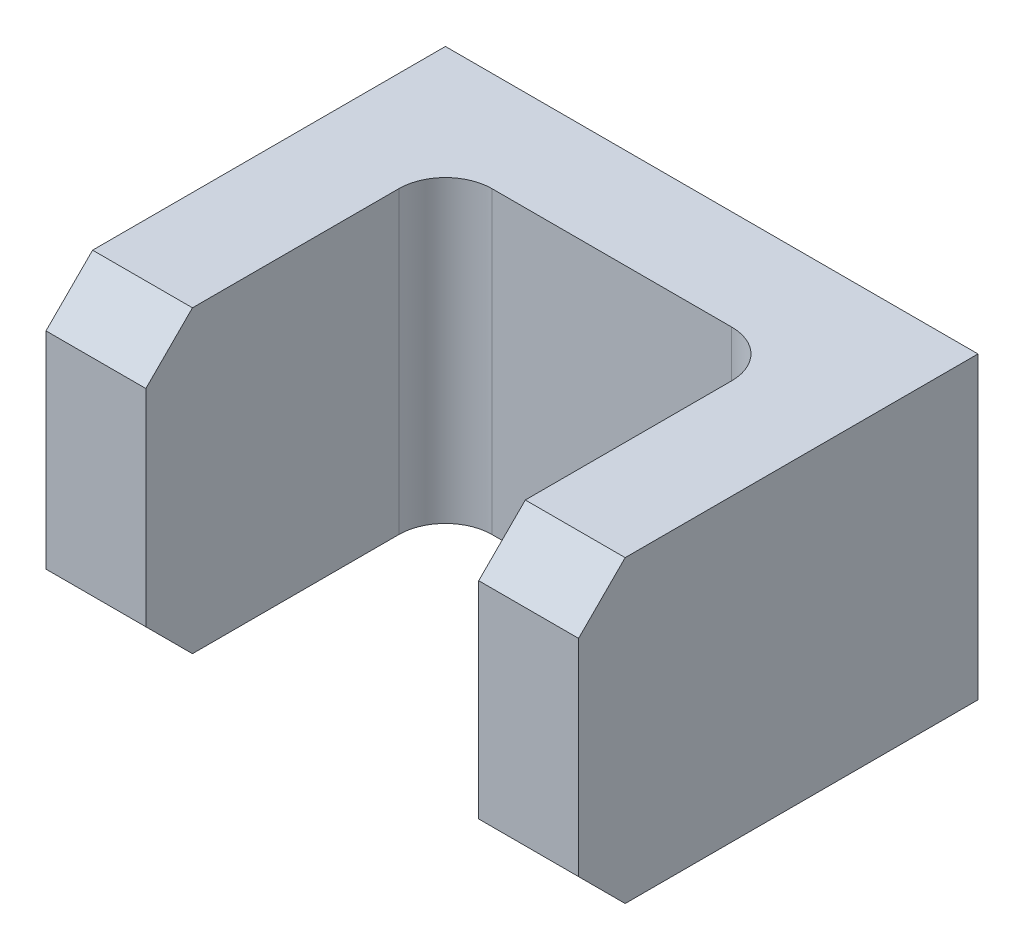
ISO-10303-21;
HEADER;
FILE_DESCRIPTION(('STEP AP214'),'2;1');
FILE_NAME('part.step','',(''),(''),'','','');
FILE_SCHEMA(('AUTOMOTIVE_DESIGN { 1 0 10303 214 1 1 1 1 }'));
ENDSEC;
DATA;
#1=APPLICATION_CONTEXT('core data for automotive mechanical design processes');
#2=APPLICATION_PROTOCOL_DEFINITION('international standard','automotive_design',2000,#1);
#3=PRODUCT_CONTEXT('',#1,'mechanical');
#4=PRODUCT('Part','Part','',(#3));
#5=PRODUCT_RELATED_PRODUCT_CATEGORY('part','',(#4));
#6=PRODUCT_DEFINITION_FORMATION('','',#4);
#7=PRODUCT_DEFINITION_CONTEXT('part definition',#1,'design');
#8=PRODUCT_DEFINITION('design','',#6,#7);
#9=PRODUCT_DEFINITION_SHAPE('','',#8);
#10=(LENGTH_UNIT() NAMED_UNIT(*) SI_UNIT(.MILLI.,.METRE.));
#11=(NAMED_UNIT(*) PLANE_ANGLE_UNIT() SI_UNIT($,.RADIAN.));
#12=(NAMED_UNIT(*) SI_UNIT($,.STERADIAN.) SOLID_ANGLE_UNIT());
#13=UNCERTAINTY_MEASURE_WITH_UNIT(LENGTH_MEASURE(1.E-05),#10,'distance_accuracy_value','');
#14=(GEOMETRIC_REPRESENTATION_CONTEXT(3) GLOBAL_UNCERTAINTY_ASSIGNED_CONTEXT((#13)) GLOBAL_UNIT_ASSIGNED_CONTEXT((#10,
#11,#12)) REPRESENTATION_CONTEXT('',''));
#15=CARTESIAN_POINT('',(0.,0.,0.));
#16=DIRECTION('',(0.,0.,1.));
#17=DIRECTION('',(1.,0.,0.));
#18=AXIS2_PLACEMENT_3D('',#15,#16,#17);
#19=CARTESIAN_POINT('',(-40.,-15.5,30.));
#20=DIRECTION('',(0.,-0.707106781186548,0.707106781186548));
#21=DIRECTION('',(0.,-0.707106781186548,-0.707106781186548));
#22=AXIS2_PLACEMENT_3D('',#19,#20,#21);
#23=PLANE('',#22);
#24=DIRECTION('',(0.,-0.707106781186548,-0.707106781186548));
#25=VECTOR('',#24,1.);
#26=CARTESIAN_POINT('',(-25.,-15.5,30.));
#27=LINE('',#26,#25);
#28=CARTESIAN_POINT('',(-25.,-15.5,30.));
#29=VERTEX_POINT('',#28);
#30=CARTESIAN_POINT('',(-25.,-22.5,23.));
#31=VERTEX_POINT('',#30);
#32=EDGE_CURVE('E193',#29,#31,#27,.T.);
#33=ORIENTED_EDGE('',*,*,#32,.F.);
#34=DIRECTION('',(1.,0.,0.));
#35=VECTOR('',#34,1.);
#36=CARTESIAN_POINT('',(-40.,-15.5,30.));
#37=LINE('',#36,#35);
#38=CARTESIAN_POINT('',(-40.,-15.5,30.));
#39=VERTEX_POINT('',#38);
#40=EDGE_CURVE('E142',#39,#29,#37,.T.);
#41=ORIENTED_EDGE('',*,*,#40,.F.);
#42=DIRECTION('',(0.,-0.707106781186547,-0.707106781186547));
#43=VECTOR('',#42,1.);
#44=CARTESIAN_POINT('',(-40.,-15.5,30.));
#45=LINE('',#44,#43);
#46=CARTESIAN_POINT('',(-40.,-22.5,23.));
#47=VERTEX_POINT('',#46);
#48=EDGE_CURVE('E140',#39,#47,#45,.T.);
#49=ORIENTED_EDGE('',*,*,#48,.T.);
#50=DIRECTION('',(1.,0.,0.));
#51=VECTOR('',#50,1.);
#52=CARTESIAN_POINT('',(-40.,-22.5,23.));
#53=LINE('',#52,#51);
#54=EDGE_CURVE('E127',#47,#31,#53,.T.);
#55=ORIENTED_EDGE('',*,*,#54,.T.);
#56=EDGE_LOOP('',(#33,#41,#49,#55));
#57=FACE_BOUND('',#56,.T.);
#58=ADVANCED_FACE('F36',(#57),#23,.T.);
#59=CARTESIAN_POINT('',(-40.,15.5,30.));
#60=DIRECTION('',(0.,0.,1.));
#61=DIRECTION('',(1.,0.,0.));
#62=AXIS2_PLACEMENT_3D('',#59,#60,#61);
#63=PLANE('',#62);
#64=DIRECTION('',(0.,1.,0.));
#65=VECTOR('',#64,1.);
#66=CARTESIAN_POINT('',(-25.,-22.5,30.));
#67=LINE('',#66,#65);
#68=CARTESIAN_POINT('',(-25.,15.5,30.));
#69=VERTEX_POINT('',#68);
#70=EDGE_CURVE('E83',#29,#69,#67,.T.);
#71=ORIENTED_EDGE('',*,*,#70,.T.);
#72=DIRECTION('',(1.,0.,0.));
#73=VECTOR('',#72,1.);
#74=CARTESIAN_POINT('',(-40.,15.5,30.));
#75=LINE('',#74,#73);
#76=CARTESIAN_POINT('',(-40.,15.5,30.));
#77=VERTEX_POINT('',#76);
#78=EDGE_CURVE('E163',#77,#69,#75,.T.);
#79=ORIENTED_EDGE('',*,*,#78,.F.);
#80=DIRECTION('',(0.,-1.,0.));
#81=VECTOR('',#80,1.);
#82=CARTESIAN_POINT('',(-40.,15.5,30.));
#83=LINE('',#82,#81);
#84=EDGE_CURVE('E146',#77,#39,#83,.T.);
#85=ORIENTED_EDGE('',*,*,#84,.T.);
#86=ORIENTED_EDGE('',*,*,#40,.T.);
#87=EDGE_LOOP('',(#71,#79,#85,#86));
#88=FACE_BOUND('',#87,.T.);
#89=ADVANCED_FACE('F224',(#88),#63,.T.);
#90=CARTESIAN_POINT('',(-40.,22.5,23.));
#91=DIRECTION('',(0.,0.707106781186548,0.707106781186548));
#92=DIRECTION('',(0.,-0.707106781186548,0.707106781186548));
#93=AXIS2_PLACEMENT_3D('',#90,#91,#92);
#94=PLANE('',#93);
#95=DIRECTION('',(0.,-0.707106781186548,0.707106781186548));
#96=VECTOR('',#95,1.);
#97=CARTESIAN_POINT('',(-25.,22.5,23.));
#98=LINE('',#97,#96);
#99=CARTESIAN_POINT('',(-25.,22.5,23.));
#100=VERTEX_POINT('',#99);
#101=EDGE_CURVE('E188',#100,#69,#98,.T.);
#102=ORIENTED_EDGE('',*,*,#101,.F.);
#103=DIRECTION('',(1.,0.,0.));
#104=VECTOR('',#103,1.);
#105=CARTESIAN_POINT('',(-40.,22.5,23.));
#106=LINE('',#105,#104);
#107=CARTESIAN_POINT('',(-40.,22.5,23.));
#108=VERTEX_POINT('',#107);
#109=EDGE_CURVE('E167',#108,#100,#106,.T.);
#110=ORIENTED_EDGE('',*,*,#109,.F.);
#111=DIRECTION('',(0.,-0.707106781186547,0.707106781186547));
#112=VECTOR('',#111,1.);
#113=CARTESIAN_POINT('',(-40.,22.5,23.));
#114=LINE('',#113,#112);
#115=EDGE_CURVE('E222',#108,#77,#114,.T.);
#116=ORIENTED_EDGE('',*,*,#115,.T.);
#117=ORIENTED_EDGE('',*,*,#78,.T.);
#118=EDGE_LOOP('',(#102,#110,#116,#117));
#119=FACE_BOUND('',#118,.T.);
#120=ADVANCED_FACE('F190',(#119),#94,.T.);
#121=CARTESIAN_POINT('',(-40.,22.5,-30.));
#122=DIRECTION('',(0.,0.,-1.));
#123=DIRECTION('',(-1.,0.,0.));
#124=AXIS2_PLACEMENT_3D('',#121,#122,#123);
#125=PLANE('',#124);
#126=DIRECTION('',(1.,0.,0.));
#127=VECTOR('',#126,1.);
#128=CARTESIAN_POINT('',(-40.,22.5,-30.));
#129=LINE('',#128,#127);
#130=CARTESIAN_POINT('',(-40.,22.5,-30.));
#131=VERTEX_POINT('',#130);
#132=CARTESIAN_POINT('',(40.,22.5,-30.));
#133=VERTEX_POINT('',#132);
#134=EDGE_CURVE('E153',#131,#133,#129,.T.);
#135=ORIENTED_EDGE('',*,*,#134,.T.);
#136=DIRECTION('',(0.,1.,0.));
#137=VECTOR('',#136,1.);
#138=CARTESIAN_POINT('',(40.,22.5,-30.));
#139=LINE('',#138,#137);
#140=CARTESIAN_POINT('',(40.,-22.5,-30.));
#141=VERTEX_POINT('',#140);
#142=EDGE_CURVE('E196',#141,#133,#139,.T.);
#143=ORIENTED_EDGE('',*,*,#142,.F.);
#144=DIRECTION('',(1.,0.,0.));
#145=VECTOR('',#144,1.);
#146=CARTESIAN_POINT('',(-40.,-22.5,-30.));
#147=LINE('',#146,#145);
#148=CARTESIAN_POINT('',(-40.,-22.5,-30.));
#149=VERTEX_POINT('',#148);
#150=EDGE_CURVE('E136',#149,#141,#147,.T.);
#151=ORIENTED_EDGE('',*,*,#150,.F.);
#152=DIRECTION('',(0.,1.,0.));
#153=VECTOR('',#152,1.);
#154=CARTESIAN_POINT('',(-40.,22.5,-30.));
#155=LINE('',#154,#153);
#156=EDGE_CURVE('E152',#149,#131,#155,.T.);
#157=ORIENTED_EDGE('',*,*,#156,.T.);
#158=EDGE_LOOP('',(#135,#143,#151,#157));
#159=FACE_BOUND('',#158,.T.);
#160=ADVANCED_FACE('F38',(#159),#125,.T.);
#161=CARTESIAN_POINT('',(-40.,-22.5,-30.));
#162=DIRECTION('',(0.,-1.,0.));
#163=DIRECTION('',(0.,0.,-1.));
#164=AXIS2_PLACEMENT_3D('',#161,#162,#163);
#165=PLANE('',#164);
#166=DIRECTION('',(0.,0.,1.));
#167=VECTOR('',#166,1.);
#168=CARTESIAN_POINT('',(-25.,-22.5,-7.99999999999994));
#169=LINE('',#168,#167);
#170=CARTESIAN_POINT('',(-25.,-22.5,-7.99999999999994));
#171=VERTEX_POINT('',#170);
#172=EDGE_CURVE('E134',#171,#31,#169,.T.);
#173=ORIENTED_EDGE('',*,*,#172,.T.);
#174=ORIENTED_EDGE('',*,*,#54,.F.);
#175=DIRECTION('',(0.,0.,-1.));
#176=VECTOR('',#175,1.);
#177=CARTESIAN_POINT('',(-40.,-22.5,-30.));
#178=LINE('',#177,#176);
#179=EDGE_CURVE('E131',#47,#149,#178,.T.);
#180=ORIENTED_EDGE('',*,*,#179,.T.);
#181=ORIENTED_EDGE('',*,*,#150,.T.);
#182=DIRECTION('',(0.,0.,-1.));
#183=VECTOR('',#182,1.);
#184=CARTESIAN_POINT('',(40.,-22.5,-30.));
#185=LINE('',#184,#183);
#186=CARTESIAN_POINT('',(40.,-22.5,23.));
#187=VERTEX_POINT('',#186);
#188=EDGE_CURVE('E216',#187,#141,#185,.T.);
#189=ORIENTED_EDGE('',*,*,#188,.F.);
#190=CARTESIAN_POINT('',(25.,-22.5,23.));
#191=VERTEX_POINT('',#190);
#192=EDGE_CURVE('E137',#191,#187,#53,.T.);
#193=ORIENTED_EDGE('',*,*,#192,.F.);
#194=DIRECTION('',(0.,0.,-1.));
#195=VECTOR('',#194,1.);
#196=CARTESIAN_POINT('',(25.,-22.5,-7.99999999999994));
#197=LINE('',#196,#195);
#198=CARTESIAN_POINT('',(25.,-22.5,-7.99999999999994));
#199=VERTEX_POINT('',#198);
#200=EDGE_CURVE('E242',#191,#199,#197,.T.);
#201=ORIENTED_EDGE('',*,*,#200,.T.);
#202=CARTESIAN_POINT('',(18.,-22.5,-7.99999999999999));
#203=DIRECTION('',(0.,1.,0.));
#204=DIRECTION('',(0.,0.,-1.));
#205=AXIS2_PLACEMENT_3D('',#202,#203,#204);
#206=CIRCLE('',#205,7.);
#207=CARTESIAN_POINT('',(18.,-22.5,-15.));
#208=VERTEX_POINT('',#207);
#209=EDGE_CURVE('E263',#199,#208,#206,.T.);
#210=ORIENTED_EDGE('',*,*,#209,.T.);
#211=DIRECTION('',(-1.,0.,0.));
#212=VECTOR('',#211,1.);
#213=CARTESIAN_POINT('',(18.,-22.5,-15.));
#214=LINE('',#213,#212);
#215=CARTESIAN_POINT('',(-18.,-22.5,-15.));
#216=VERTEX_POINT('',#215);
#217=EDGE_CURVE('E267',#208,#216,#214,.T.);
#218=ORIENTED_EDGE('',*,*,#217,.T.);
#219=CARTESIAN_POINT('',(-18.,-22.5,-7.99999999999999));
#220=DIRECTION('',(0.,1.,0.));
#221=DIRECTION('',(0.,0.,-1.));
#222=AXIS2_PLACEMENT_3D('',#219,#220,#221);
#223=CIRCLE('',#222,7.);
#224=EDGE_CURVE('E269',#216,#171,#223,.T.);
#225=ORIENTED_EDGE('',*,*,#224,.T.);
#226=EDGE_LOOP('',(#173,#174,#180,#181,#189,#193,#201,#210,#218,#225));
#227=FACE_BOUND('',#226,.T.);
#228=ADVANCED_FACE('F129',(#227),#165,.T.);
#229=DIRECTION('',(0.,0.707106781186548,0.707106781186548));
#230=VECTOR('',#229,1.);
#231=CARTESIAN_POINT('',(25.,-15.5,30.));
#232=LINE('',#231,#230);
#233=CARTESIAN_POINT('',(25.,-15.5,30.));
#234=VERTEX_POINT('',#233);
#235=EDGE_CURVE('E194',#191,#234,#232,.T.);
#236=ORIENTED_EDGE('',*,*,#235,.F.);
#237=ORIENTED_EDGE('',*,*,#192,.T.);
#238=DIRECTION('',(0.,-0.707106781186547,-0.707106781186547));
#239=VECTOR('',#238,1.);
#240=CARTESIAN_POINT('',(40.,-15.5,30.));
#241=LINE('',#240,#239);
#242=CARTESIAN_POINT('',(40.,-15.5,30.));
#243=VERTEX_POINT('',#242);
#244=EDGE_CURVE('E213',#243,#187,#241,.T.);
#245=ORIENTED_EDGE('',*,*,#244,.F.);
#246=EDGE_CURVE('E162',#234,#243,#37,.T.);
#247=ORIENTED_EDGE('',*,*,#246,.F.);
#248=EDGE_LOOP('',(#236,#237,#245,#247));
#249=FACE_BOUND('',#248,.T.);
#250=ADVANCED_FACE('F237',(#249),#23,.T.);
#251=DIRECTION('',(0.,1.,0.));
#252=VECTOR('',#251,1.);
#253=CARTESIAN_POINT('',(25.,-22.5,30.));
#254=LINE('',#253,#252);
#255=CARTESIAN_POINT('',(25.,15.5,30.));
#256=VERTEX_POINT('',#255);
#257=EDGE_CURVE('E246',#234,#256,#254,.T.);
#258=ORIENTED_EDGE('',*,*,#257,.F.);
#259=ORIENTED_EDGE('',*,*,#246,.T.);
#260=DIRECTION('',(0.,-1.,0.));
#261=VECTOR('',#260,1.);
#262=CARTESIAN_POINT('',(40.,15.5,30.));
#263=LINE('',#262,#261);
#264=CARTESIAN_POINT('',(40.,15.5,30.));
#265=VERTEX_POINT('',#264);
#266=EDGE_CURVE('E210',#265,#243,#263,.T.);
#267=ORIENTED_EDGE('',*,*,#266,.F.);
#268=EDGE_CURVE('E166',#256,#265,#75,.T.);
#269=ORIENTED_EDGE('',*,*,#268,.F.);
#270=EDGE_LOOP('',(#258,#259,#267,#269));
#271=FACE_BOUND('',#270,.T.);
#272=ADVANCED_FACE('F286',(#271),#63,.T.);
#273=DIRECTION('',(0.,0.707106781186548,-0.707106781186548));
#274=VECTOR('',#273,1.);
#275=CARTESIAN_POINT('',(25.,22.5,23.));
#276=LINE('',#275,#274);
#277=CARTESIAN_POINT('',(25.,22.5,23.));
#278=VERTEX_POINT('',#277);
#279=EDGE_CURVE('E54',#256,#278,#276,.T.);
#280=ORIENTED_EDGE('',*,*,#279,.F.);
#281=ORIENTED_EDGE('',*,*,#268,.T.);
#282=DIRECTION('',(0.,-0.707106781186547,0.707106781186547));
#283=VECTOR('',#282,1.);
#284=CARTESIAN_POINT('',(40.,22.5,23.));
#285=LINE('',#284,#283);
#286=CARTESIAN_POINT('',(40.,22.5,23.));
#287=VERTEX_POINT('',#286);
#288=EDGE_CURVE('E207',#287,#265,#285,.T.);
#289=ORIENTED_EDGE('',*,*,#288,.F.);
#290=EDGE_CURVE('E155',#278,#287,#106,.T.);
#291=ORIENTED_EDGE('',*,*,#290,.F.);
#292=EDGE_LOOP('',(#280,#281,#289,#291));
#293=FACE_BOUND('',#292,.T.);
#294=ADVANCED_FACE('F283',(#293),#94,.T.);
#295=CARTESIAN_POINT('',(-40.,22.5,-30.));
#296=DIRECTION('',(0.,1.,0.));
#297=DIRECTION('',(0.,0.,1.));
#298=AXIS2_PLACEMENT_3D('',#295,#296,#297);
#299=PLANE('',#298);
#300=DIRECTION('',(0.,0.,1.));
#301=VECTOR('',#300,1.);
#302=CARTESIAN_POINT('',(-25.,22.5,-30.));
#303=LINE('',#302,#301);
#304=CARTESIAN_POINT('',(-25.,22.5,-7.99999999999997));
#305=VERTEX_POINT('',#304);
#306=EDGE_CURVE('E12',#305,#100,#303,.T.);
#307=ORIENTED_EDGE('',*,*,#306,.F.);
#308=CARTESIAN_POINT('',(-18.,22.5,-7.99999999999999));
#309=DIRECTION('',(0.,1.,0.));
#310=DIRECTION('',(0.,0.,1.));
#311=AXIS2_PLACEMENT_3D('',#308,#309,#310);
#312=CIRCLE('',#311,7.);
#313=CARTESIAN_POINT('',(-18.,22.5,-15.));
#314=VERTEX_POINT('',#313);
#315=EDGE_CURVE('E40',#314,#305,#312,.T.);
#316=ORIENTED_EDGE('',*,*,#315,.F.);
#317=DIRECTION('',(-1.,0.,0.));
#318=VECTOR('',#317,1.);
#319=CARTESIAN_POINT('',(18.,22.5,-15.));
#320=LINE('',#319,#318);
#321=CARTESIAN_POINT('',(18.,22.5,-15.));
#322=VERTEX_POINT('',#321);
#323=EDGE_CURVE('E74',#322,#314,#320,.T.);
#324=ORIENTED_EDGE('',*,*,#323,.F.);
#325=CARTESIAN_POINT('',(18.,22.5,-7.99999999999999));
#326=DIRECTION('',(0.,1.,0.));
#327=DIRECTION('',(0.,0.,1.));
#328=AXIS2_PLACEMENT_3D('',#325,#326,#327);
#329=CIRCLE('',#328,7.);
#330=CARTESIAN_POINT('',(25.,22.5,-7.99999999999997));
#331=VERTEX_POINT('',#330);
#332=EDGE_CURVE('E170',#331,#322,#329,.T.);
#333=ORIENTED_EDGE('',*,*,#332,.F.);
#334=DIRECTION('',(0.,0.,-1.));
#335=VECTOR('',#334,1.);
#336=CARTESIAN_POINT('',(25.,22.5,-30.));
#337=LINE('',#336,#335);
#338=EDGE_CURVE('E159',#278,#331,#337,.T.);
#339=ORIENTED_EDGE('',*,*,#338,.F.);
#340=ORIENTED_EDGE('',*,*,#290,.T.);
#341=DIRECTION('',(0.,0.,1.));
#342=VECTOR('',#341,1.);
#343=CARTESIAN_POINT('',(40.,22.5,-30.));
#344=LINE('',#343,#342);
#345=EDGE_CURVE('E204',#133,#287,#344,.T.);
#346=ORIENTED_EDGE('',*,*,#345,.F.);
#347=ORIENTED_EDGE('',*,*,#134,.F.);
#348=DIRECTION('',(0.,0.,1.));
#349=VECTOR('',#348,1.);
#350=CARTESIAN_POINT('',(-40.,22.5,-30.));
#351=LINE('',#350,#349);
#352=EDGE_CURVE('E220',#131,#108,#351,.T.);
#353=ORIENTED_EDGE('',*,*,#352,.T.);
#354=ORIENTED_EDGE('',*,*,#109,.T.);
#355=EDGE_LOOP('',(#307,#316,#324,#333,#339,#340,#346,#347,#353,#354));
#356=FACE_BOUND('',#355,.T.);
#357=ADVANCED_FACE('F184',(#356),#299,.T.);
#358=CARTESIAN_POINT('',(-40.,0.,0.));
#359=DIRECTION('',(-1.,0.,0.));
#360=DIRECTION('',(0.,0.,1.));
#361=AXIS2_PLACEMENT_3D('',#358,#359,#360);
#362=PLANE('',#361);
#363=ORIENTED_EDGE('',*,*,#156,.F.);
#364=ORIENTED_EDGE('',*,*,#179,.F.);
#365=ORIENTED_EDGE('',*,*,#48,.F.);
#366=ORIENTED_EDGE('',*,*,#84,.F.);
#367=ORIENTED_EDGE('',*,*,#115,.F.);
#368=ORIENTED_EDGE('',*,*,#352,.F.);
#369=EDGE_LOOP('',(#363,#364,#365,#366,#367,#368));
#370=FACE_BOUND('',#369,.T.);
#371=ADVANCED_FACE('F149',(#370),#362,.T.);
#372=CARTESIAN_POINT('',(40.,0.,0.));
#373=DIRECTION('',(-1.,0.,0.));
#374=DIRECTION('',(0.,0.,1.));
#375=AXIS2_PLACEMENT_3D('',#372,#373,#374);
#376=PLANE('',#375);
#377=ORIENTED_EDGE('',*,*,#142,.T.);
#378=ORIENTED_EDGE('',*,*,#345,.T.);
#379=ORIENTED_EDGE('',*,*,#288,.T.);
#380=ORIENTED_EDGE('',*,*,#266,.T.);
#381=ORIENTED_EDGE('',*,*,#244,.T.);
#382=ORIENTED_EDGE('',*,*,#188,.T.);
#383=EDGE_LOOP('',(#377,#378,#379,#380,#381,#382));
#384=FACE_BOUND('',#383,.T.);
#385=ADVANCED_FACE('F231',(#384),#376,.F.);
#386=CARTESIAN_POINT('',(-25.,-22.5,-7.99999999999994));
#387=DIRECTION('',(-1.,0.,0.));
#388=DIRECTION('',(0.,0.,1.));
#389=AXIS2_PLACEMENT_3D('',#386,#387,#388);
#390=PLANE('',#389);
#391=ORIENTED_EDGE('',*,*,#32,.T.);
#392=ORIENTED_EDGE('',*,*,#172,.F.);
#393=DIRECTION('',(0.,1.,0.));
#394=VECTOR('',#393,1.);
#395=CARTESIAN_POINT('',(-25.,-22.5,-7.99999999999994));
#396=LINE('',#395,#394);
#397=EDGE_CURVE('E181',#171,#305,#396,.T.);
#398=ORIENTED_EDGE('',*,*,#397,.T.);
#399=ORIENTED_EDGE('',*,*,#306,.T.);
#400=ORIENTED_EDGE('',*,*,#101,.T.);
#401=ORIENTED_EDGE('',*,*,#70,.F.);
#402=EDGE_LOOP('',(#391,#392,#398,#399,#400,#401));
#403=FACE_BOUND('',#402,.T.);
#404=ADVANCED_FACE('F187',(#403),#390,.F.);
#405=CARTESIAN_POINT('',(-18.,-22.5,-7.99999999999999));
#406=DIRECTION('',(0.,1.,0.));
#407=DIRECTION('',(0.,0.,1.));
#408=AXIS2_PLACEMENT_3D('',#405,#406,#407);
#409=CYLINDRICAL_SURFACE('',#408,7.);
#410=ORIENTED_EDGE('',*,*,#315,.T.);
#411=ORIENTED_EDGE('',*,*,#397,.F.);
#412=ORIENTED_EDGE('',*,*,#224,.F.);
#413=DIRECTION('',(0.,1.,0.));
#414=VECTOR('',#413,1.);
#415=CARTESIAN_POINT('',(-18.,-22.5,-15.));
#416=LINE('',#415,#414);
#417=EDGE_CURVE('E182',#216,#314,#416,.T.);
#418=ORIENTED_EDGE('',*,*,#417,.T.);
#419=EDGE_LOOP('',(#410,#411,#412,#418));
#420=FACE_BOUND('',#419,.T.);
#421=ADVANCED_FACE('F177',(#420),#409,.F.);
#422=CARTESIAN_POINT('',(18.,-22.5,-15.));
#423=DIRECTION('',(0.,0.,-1.));
#424=DIRECTION('',(-1.,0.,0.));
#425=AXIS2_PLACEMENT_3D('',#422,#423,#424);
#426=PLANE('',#425);
#427=ORIENTED_EDGE('',*,*,#323,.T.);
#428=ORIENTED_EDGE('',*,*,#417,.F.);
#429=ORIENTED_EDGE('',*,*,#217,.F.);
#430=DIRECTION('',(0.,1.,0.));
#431=VECTOR('',#430,1.);
#432=CARTESIAN_POINT('',(18.,-22.5,-15.));
#433=LINE('',#432,#431);
#434=EDGE_CURVE('E261',#208,#322,#433,.T.);
#435=ORIENTED_EDGE('',*,*,#434,.T.);
#436=EDGE_LOOP('',(#427,#428,#429,#435));
#437=FACE_BOUND('',#436,.T.);
#438=ADVANCED_FACE('F279',(#437),#426,.F.);
#439=CARTESIAN_POINT('',(18.,-22.5,-7.99999999999999));
#440=DIRECTION('',(0.,1.,0.));
#441=DIRECTION('',(0.,0.,1.));
#442=AXIS2_PLACEMENT_3D('',#439,#440,#441);
#443=CYLINDRICAL_SURFACE('',#442,7.);
#444=ORIENTED_EDGE('',*,*,#332,.T.);
#445=ORIENTED_EDGE('',*,*,#434,.F.);
#446=ORIENTED_EDGE('',*,*,#209,.F.);
#447=DIRECTION('',(0.,1.,0.));
#448=VECTOR('',#447,1.);
#449=CARTESIAN_POINT('',(25.,-22.5,-7.99999999999994));
#450=LINE('',#449,#448);
#451=EDGE_CURVE('E256',#199,#331,#450,.T.);
#452=ORIENTED_EDGE('',*,*,#451,.T.);
#453=EDGE_LOOP('',(#444,#445,#446,#452));
#454=FACE_BOUND('',#453,.T.);
#455=ADVANCED_FACE('F264',(#454),#443,.F.);
#456=CARTESIAN_POINT('',(25.,-22.5,-7.99999999999994));
#457=DIRECTION('',(1.,0.,0.));
#458=DIRECTION('',(0.,0.,-1.));
#459=AXIS2_PLACEMENT_3D('',#456,#457,#458);
#460=PLANE('',#459);
#461=ORIENTED_EDGE('',*,*,#235,.T.);
#462=ORIENTED_EDGE('',*,*,#257,.T.);
#463=ORIENTED_EDGE('',*,*,#279,.T.);
#464=ORIENTED_EDGE('',*,*,#338,.T.);
#465=ORIENTED_EDGE('',*,*,#451,.F.);
#466=ORIENTED_EDGE('',*,*,#200,.F.);
#467=EDGE_LOOP('',(#461,#462,#463,#464,#465,#466));
#468=FACE_BOUND('',#467,.T.);
#469=ADVANCED_FACE('F258',(#468),#460,.F.);
#470=CLOSED_SHELL('',(#58,#89,#120,#160,#228,#250,#272,#294,#357,#371,#385,#404,#421,#438,#455,#469));
#471=MANIFOLD_SOLID_BREP('B2',#470);
#472=ADVANCED_BREP_SHAPE_REPRESENTATION('',(#18,#471),#14);
#473=SHAPE_DEFINITION_REPRESENTATION(#9,#472);
ENDSEC;
END-ISO-10303-21;
